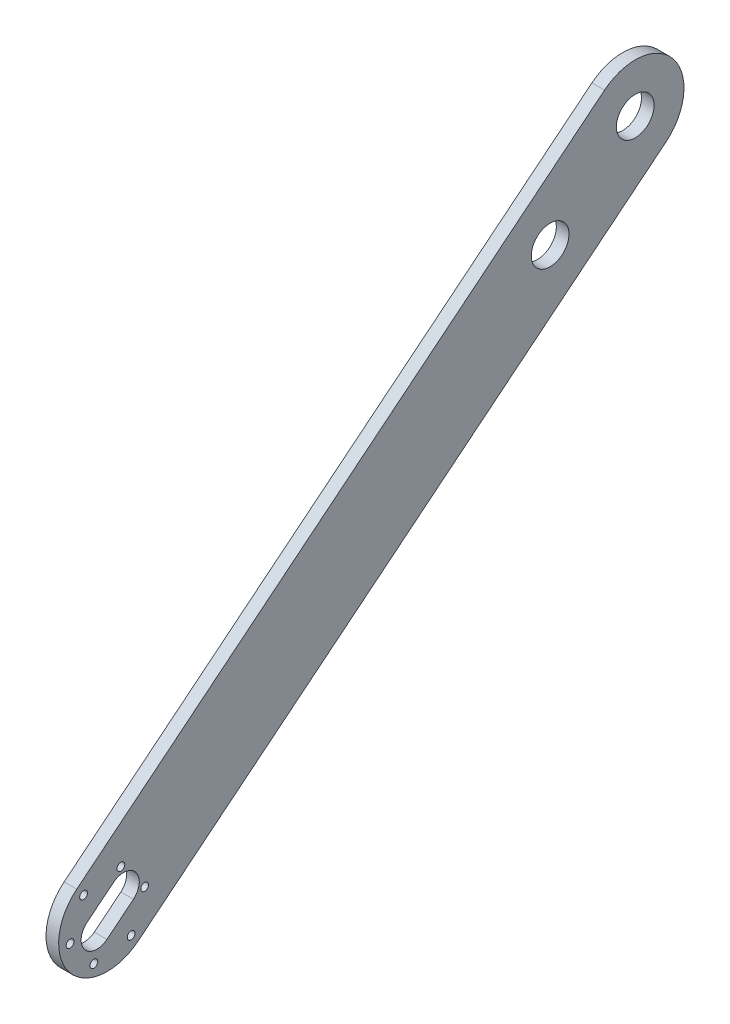
ISO-10303-21;
HEADER;
FILE_DESCRIPTION(('STEP AP214'),'2;1');
FILE_NAME('part.step','',(''),(''),'','','');
FILE_SCHEMA(('AUTOMOTIVE_DESIGN { 1 0 10303 214 1 1 1 1 }'));
ENDSEC;
DATA;
#1=APPLICATION_CONTEXT('core data for automotive mechanical design processes');
#2=APPLICATION_PROTOCOL_DEFINITION('international standard','automotive_design',2000,#1);
#3=PRODUCT_CONTEXT('',#1,'mechanical');
#4=PRODUCT('Part','Part','',(#3));
#5=PRODUCT_RELATED_PRODUCT_CATEGORY('part','',(#4));
#6=PRODUCT_DEFINITION_FORMATION('','',#4);
#7=PRODUCT_DEFINITION_CONTEXT('part definition',#1,'design');
#8=PRODUCT_DEFINITION('design','',#6,#7);
#9=PRODUCT_DEFINITION_SHAPE('','',#8);
#10=(LENGTH_UNIT() NAMED_UNIT(*) SI_UNIT(.MILLI.,.METRE.));
#11=(NAMED_UNIT(*) PLANE_ANGLE_UNIT() SI_UNIT($,.RADIAN.));
#12=(NAMED_UNIT(*) SI_UNIT($,.STERADIAN.) SOLID_ANGLE_UNIT());
#13=UNCERTAINTY_MEASURE_WITH_UNIT(LENGTH_MEASURE(1.E-05),#10,'distance_accuracy_value','');
#14=(GEOMETRIC_REPRESENTATION_CONTEXT(3) GLOBAL_UNCERTAINTY_ASSIGNED_CONTEXT((#13)) GLOBAL_UNIT_ASSIGNED_CONTEXT((#10,
#11,#12)) REPRESENTATION_CONTEXT('',''));
#15=CARTESIAN_POINT('',(0.,0.,0.));
#16=DIRECTION('',(0.,0.,1.));
#17=DIRECTION('',(1.,0.,0.));
#18=AXIS2_PLACEMENT_3D('',#15,#16,#17);
#19=CARTESIAN_POINT('',(5.1784,-110.321402288377,136.021274412376));
#20=DIRECTION('',(1.,0.,0.));
#21=DIRECTION('',(0.,0.,-1.));
#22=AXIS2_PLACEMENT_3D('',#19,#20,#21);
#23=PLANE('',#22);
#24=CARTESIAN_POINT('',(5.1784,-107.884879342951,120.713976939065));
#25=DIRECTION('',(1.,0.,0.));
#26=DIRECTION('',(0.,0.,-1.));
#27=AXIS2_PLACEMENT_3D('',#24,#25,#26);
#28=CIRCLE('',#27,1.59999999999996);
#29=CARTESIAN_POINT('',(5.1784,-107.884879342951,119.113976939065));
#30=VERTEX_POINT('',#29);
#31=EDGE_CURVE('E289',#30,#30,#28,.T.);
#32=ORIENTED_EDGE('',*,*,#31,.F.);
#33=EDGE_LOOP('',(#32));
#34=FACE_BOUND('',#33,.T.);
#35=CARTESIAN_POINT('',(5.1784,-98.2831552859189,145.785013916674));
#36=DIRECTION('',(1.,0.,0.));
#37=DIRECTION('',(0.,0.,-1.));
#38=AXIS2_PLACEMENT_3D('',#35,#36,#37);
#39=CIRCLE('',#38,1.60000000000002);
#40=CARTESIAN_POINT('',(5.1784,-98.2831552859189,144.185013916674));
#41=VERTEX_POINT('',#40);
#42=EDGE_CURVE('E301',#41,#41,#39,.T.);
#43=ORIENTED_EDGE('',*,*,#42,.F.);
#44=EDGE_LOOP('',(#43));
#45=FACE_BOUND('',#44,.T.);
#46=CARTESIAN_POINT('',(5.1784,-124.796172236263,141.564832381388));
#47=DIRECTION('',(1.,0.,0.));
#48=DIRECTION('',(0.,0.,-1.));
#49=AXIS2_PLACEMENT_3D('',#46,#47,#48);
#50=CIRCLE('',#49,1.59999999999999);
#51=CARTESIAN_POINT('',(5.1784,-124.796172236263,139.964832381388));
#52=VERTEX_POINT('',#51);
#53=EDGE_CURVE('E135',#52,#52,#50,.T.);
#54=ORIENTED_EDGE('',*,*,#53,.F.);
#55=EDGE_LOOP('',(#54));
#56=FACE_BOUND('',#55,.T.);
#57=CARTESIAN_POINT('',(5.1784,65.4259087889907,-80.6671716318812));
#58=DIRECTION('',(1.,0.,0.));
#59=DIRECTION('',(0.,0.,-1.));
#60=AXIS2_PLACEMENT_3D('',#57,#58,#59);
#61=CIRCLE('',#60,7.73749999999999);
#62=CARTESIAN_POINT('',(5.1784,65.4259087889907,-88.4046716318812));
#63=VERTEX_POINT('',#62);
#64=EDGE_CURVE('E151',#63,#63,#61,.T.);
#65=ORIENTED_EDGE('',*,*,#64,.F.);
#66=EDGE_LOOP('',(#65));
#67=FACE_BOUND('',#66,.T.);
#68=CARTESIAN_POINT('',(5.1784,-110.321402288377,136.021274412376));
#69=DIRECTION('',(1.,0.,0.));
#70=DIRECTION('',(0.,0.,-1.));
#71=AXIS2_PLACEMENT_3D('',#68,#69,#70);
#72=CIRCLE('',#71,20.);
#73=CARTESIAN_POINT('',(5.1784,-94.7881803497211,148.619647966309));
#74=VERTEX_POINT('',#73);
#75=CARTESIAN_POINT('',(5.1784,-125.854624227034,123.422900858442));
#76=VERTEX_POINT('',#75);
#77=EDGE_CURVE('E157',#74,#76,#72,.T.);
#78=ORIENTED_EDGE('',*,*,#77,.T.);
#79=DIRECTION('',(0.,0.62991867769666,-0.77666109693282));
#80=VECTOR('',#79,1.);
#81=CARTESIAN_POINT('',(5.1784,-125.854624227034,123.422900858442));
#82=LINE('',#81,#80);
#83=CARTESIAN_POINT('',(5.1784,49.8926868503343,-93.2655451858144));
#84=VERTEX_POINT('',#83);
#85=EDGE_CURVE('E160',#76,#84,#82,.T.);
#86=ORIENTED_EDGE('',*,*,#85,.T.);
#87=CARTESIAN_POINT('',(5.1784,65.4259087889907,-80.6671716318812));
#88=DIRECTION('',(1.,0.,0.));
#89=DIRECTION('',(0.,0.,-1.));
#90=AXIS2_PLACEMENT_3D('',#87,#88,#89);
#91=CIRCLE('',#90,20.);
#92=CARTESIAN_POINT('',(5.1784,80.9591307276471,-68.068798077948));
#93=VERTEX_POINT('',#92);
#94=EDGE_CURVE('E163',#84,#93,#91,.T.);
#95=ORIENTED_EDGE('',*,*,#94,.T.);
#96=DIRECTION('',(0.,-0.62991867769666,0.77666109693282));
#97=VECTOR('',#96,1.);
#98=CARTESIAN_POINT('',(5.1784,-94.7881803497211,148.619647966309));
#99=LINE('',#98,#97);
#100=EDGE_CURVE('E165',#93,#74,#99,.T.);
#101=ORIENTED_EDGE('',*,*,#100,.T.);
#102=EDGE_LOOP('',(#78,#86,#95,#101));
#103=FACE_BOUND('',#102,.T.);
#104=CARTESIAN_POINT('',(5.1784,37.079568292641,-45.7174222699043));
#105=DIRECTION('',(1.,0.,0.));
#106=DIRECTION('',(0.,0.,-1.));
#107=AXIS2_PLACEMENT_3D('',#104,#105,#106);
#108=CIRCLE('',#107,7.7375);
#109=CARTESIAN_POINT('',(5.1784,37.079568292641,-53.4549222699043));
#110=VERTEX_POINT('',#109);
#111=EDGE_CURVE('E145',#110,#110,#108,.T.);
#112=ORIENTED_EDGE('',*,*,#111,.F.);
#113=EDGE_LOOP('',(#112));
#114=FACE_BOUND('',#113,.T.);
#115=DIRECTION('',(0.,-0.629918677696662,0.776661096932819));
#116=VECTOR('',#115,1.);
#117=CARTESIAN_POINT('',(5.1784,-99.9187963978926,133.514126493475));
#118=LINE('',#117,#116);
#119=CARTESIAN_POINT('',(5.1784,-99.9187963978926,133.514126493475));
#120=VERTEX_POINT('',#119);
#121=CARTESIAN_POINT('',(5.1784,-108.737657885646,144.387381850534));
#122=VERTEX_POINT('',#121);
#123=EDGE_CURVE('E114',#120,#122,#118,.T.);
#124=ORIENTED_EDGE('',*,*,#123,.F.);
#125=CARTESIAN_POINT('',(5.1784,-104.967093527956,129.419655088447));
#126=DIRECTION('',(1.,0.,0.));
#127=DIRECTION('',(0.,0.,-1.));
#128=AXIS2_PLACEMENT_3D('',#125,#126,#127);
#129=CIRCLE('',#128,6.50000000000002);
#130=CARTESIAN_POINT('',(5.1784,-110.015390658019,125.325183683418));
#131=VERTEX_POINT('',#130);
#132=EDGE_CURVE('E106',#131,#120,#129,.T.);
#133=ORIENTED_EDGE('',*,*,#132,.F.);
#134=DIRECTION('',(0.,0.629918677696659,-0.77666109693282));
#135=VECTOR('',#134,1.);
#136=CARTESIAN_POINT('',(5.1784,-110.015390658019,125.325183683418));
#137=LINE('',#136,#135);
#138=CARTESIAN_POINT('',(5.1784,-118.834252145773,136.198439040478));
#139=VERTEX_POINT('',#138);
#140=EDGE_CURVE('E129',#139,#131,#137,.T.);
#141=ORIENTED_EDGE('',*,*,#140,.F.);
#142=CARTESIAN_POINT('',(5.1784,-113.785955015709,140.292910445506));
#143=DIRECTION('',(1.,0.,0.));
#144=DIRECTION('',(0.,0.,-1.));
#145=AXIS2_PLACEMENT_3D('',#142,#143,#144);
#146=CIRCLE('',#145,6.5);
#147=EDGE_CURVE('E127',#122,#139,#146,.T.);
#148=ORIENTED_EDGE('',*,*,#147,.F.);
#149=EDGE_LOOP('',(#124,#133,#141,#148));
#150=FACE_BOUND('',#149,.T.);
#151=CARTESIAN_POINT('',(5.1784,-112.757925233804,151.328571885686));
#152=DIRECTION('',(1.,0.,0.));
#153=DIRECTION('',(0.,0.,-1.));
#154=AXIS2_PLACEMENT_3D('',#151,#152,#153);
#155=CIRCLE('',#154,1.59999999999999);
#156=CARTESIAN_POINT('',(5.1784,-112.757925233804,149.728571885686));
#157=VERTEX_POINT('',#156);
#158=EDGE_CURVE('E307',#157,#157,#155,.T.);
#159=ORIENTED_EDGE('',*,*,#158,.F.);
#160=EDGE_LOOP('',(#159));
#161=FACE_BOUND('',#160,.T.);
#162=CARTESIAN_POINT('',(5.1784,-95.8466323404922,130.477716443364));
#163=DIRECTION('',(1.,0.,0.));
#164=DIRECTION('',(0.,0.,-1.));
#165=AXIS2_PLACEMENT_3D('',#162,#163,#164);
#166=CIRCLE('',#165,1.60000000000002);
#167=CARTESIAN_POINT('',(5.1784,-95.8466323404922,128.877716443364));
#168=VERTEX_POINT('',#167);
#169=EDGE_CURVE('E295',#168,#168,#166,.T.);
#170=ORIENTED_EDGE('',*,*,#169,.F.);
#171=EDGE_LOOP('',(#170));
#172=FACE_BOUND('',#171,.T.);
#173=CARTESIAN_POINT('',(5.1784,-122.359649290836,126.257534908077));
#174=DIRECTION('',(1.,0.,0.));
#175=DIRECTION('',(0.,0.,-1.));
#176=AXIS2_PLACEMENT_3D('',#173,#174,#175);
#177=CIRCLE('',#176,1.59999999999999);
#178=CARTESIAN_POINT('',(5.1784,-122.359649290836,124.657534908077));
#179=VERTEX_POINT('',#178);
#180=EDGE_CURVE('E280',#179,#179,#177,.T.);
#181=ORIENTED_EDGE('',*,*,#180,.F.);
#182=EDGE_LOOP('',(#181));
#183=FACE_BOUND('',#182,.T.);
#184=ADVANCED_FACE('F41',(#34,#45,#56,#67,#103,#114,#150,#161,#172,#183),#23,.T.);
#185=CARTESIAN_POINT('',(0.,-110.321402288377,136.021274412376));
#186=DIRECTION('',(1.,0.,0.));
#187=DIRECTION('',(0.,0.,-1.));
#188=AXIS2_PLACEMENT_3D('',#185,#186,#187);
#189=PLANE('',#188);
#190=CARTESIAN_POINT('',(0.,37.079568292641,-45.7174222699043));
#191=DIRECTION('',(1.,0.,0.));
#192=DIRECTION('',(0.,0.,-1.));
#193=AXIS2_PLACEMENT_3D('',#190,#191,#192);
#194=CIRCLE('',#193,7.7375);
#195=CARTESIAN_POINT('',(0.,37.079568292641,-53.4549222699043));
#196=VERTEX_POINT('',#195);
#197=EDGE_CURVE('E122',#196,#196,#194,.T.);
#198=ORIENTED_EDGE('',*,*,#197,.T.);
#199=EDGE_LOOP('',(#198));
#200=FACE_BOUND('',#199,.T.);
#201=CARTESIAN_POINT('',(0.,65.4259087889907,-80.6671716318812));
#202=DIRECTION('',(1.,0.,0.));
#203=DIRECTION('',(0.,0.,-1.));
#204=AXIS2_PLACEMENT_3D('',#201,#202,#203);
#205=CIRCLE('',#204,7.73749999999999);
#206=CARTESIAN_POINT('',(0.,65.4259087889907,-88.4046716318812));
#207=VERTEX_POINT('',#206);
#208=EDGE_CURVE('E148',#207,#207,#205,.T.);
#209=ORIENTED_EDGE('',*,*,#208,.T.);
#210=EDGE_LOOP('',(#209));
#211=FACE_BOUND('',#210,.T.);
#212=CARTESIAN_POINT('',(0.,-110.321402288377,136.021274412376));
#213=DIRECTION('',(1.,0.,0.));
#214=DIRECTION('',(0.,0.,-1.));
#215=AXIS2_PLACEMENT_3D('',#212,#213,#214);
#216=CIRCLE('',#215,20.);
#217=CARTESIAN_POINT('',(0.,-94.7881803497211,148.619647966309));
#218=VERTEX_POINT('',#217);
#219=CARTESIAN_POINT('',(0.,-125.854624227034,123.422900858442));
#220=VERTEX_POINT('',#219);
#221=EDGE_CURVE('E154',#218,#220,#216,.T.);
#222=ORIENTED_EDGE('',*,*,#221,.F.);
#223=DIRECTION('',(0.,-0.62991867769666,0.77666109693282));
#224=VECTOR('',#223,1.);
#225=CARTESIAN_POINT('',(0.,-94.7881803497211,148.619647966309));
#226=LINE('',#225,#224);
#227=CARTESIAN_POINT('',(0.,80.9591307276471,-68.068798077948));
#228=VERTEX_POINT('',#227);
#229=EDGE_CURVE('E161',#228,#218,#226,.T.);
#230=ORIENTED_EDGE('',*,*,#229,.F.);
#231=CARTESIAN_POINT('',(0.,65.4259087889907,-80.6671716318812));
#232=DIRECTION('',(1.,0.,0.));
#233=DIRECTION('',(0.,0.,-1.));
#234=AXIS2_PLACEMENT_3D('',#231,#232,#233);
#235=CIRCLE('',#234,20.);
#236=CARTESIAN_POINT('',(0.,49.8926868503343,-93.2655451858144));
#237=VERTEX_POINT('',#236);
#238=EDGE_CURVE('E172',#237,#228,#235,.T.);
#239=ORIENTED_EDGE('',*,*,#238,.F.);
#240=DIRECTION('',(0.,0.62991867769666,-0.77666109693282));
#241=VECTOR('',#240,1.);
#242=CARTESIAN_POINT('',(0.,-125.854624227034,123.422900858442));
#243=LINE('',#242,#241);
#244=EDGE_CURVE('E170',#220,#237,#243,.T.);
#245=ORIENTED_EDGE('',*,*,#244,.F.);
#246=EDGE_LOOP('',(#222,#230,#239,#245));
#247=FACE_BOUND('',#246,.T.);
#248=CARTESIAN_POINT('',(0.,-104.967093527956,129.419655088447));
#249=DIRECTION('',(1.,0.,0.));
#250=DIRECTION('',(0.,0.,-1.));
#251=AXIS2_PLACEMENT_3D('',#248,#249,#250);
#252=CIRCLE('',#251,6.50000000000002);
#253=CARTESIAN_POINT('',(0.,-110.015390658019,125.325183683418));
#254=VERTEX_POINT('',#253);
#255=CARTESIAN_POINT('',(0.,-99.9187963978926,133.514126493475));
#256=VERTEX_POINT('',#255);
#257=EDGE_CURVE('E64',#254,#256,#252,.T.);
#258=ORIENTED_EDGE('',*,*,#257,.T.);
#259=DIRECTION('',(0.,-0.629918677696662,0.776661096932819));
#260=VECTOR('',#259,1.);
#261=CARTESIAN_POINT('',(0.,-99.9187963978926,133.514126493475));
#262=LINE('',#261,#260);
#263=CARTESIAN_POINT('',(0.,-108.737657885646,144.387381850534));
#264=VERTEX_POINT('',#263);
#265=EDGE_CURVE('E121',#256,#264,#262,.T.);
#266=ORIENTED_EDGE('',*,*,#265,.T.);
#267=CARTESIAN_POINT('',(0.,-113.785955015709,140.292910445506));
#268=DIRECTION('',(1.,0.,0.));
#269=DIRECTION('',(0.,0.,-1.));
#270=AXIS2_PLACEMENT_3D('',#267,#268,#269);
#271=CIRCLE('',#270,6.5);
#272=CARTESIAN_POINT('',(0.,-118.834252145773,136.198439040478));
#273=VERTEX_POINT('',#272);
#274=EDGE_CURVE('E137',#264,#273,#271,.T.);
#275=ORIENTED_EDGE('',*,*,#274,.T.);
#276=DIRECTION('',(0.,0.629918677696659,-0.77666109693282));
#277=VECTOR('',#276,1.);
#278=CARTESIAN_POINT('',(0.,-110.015390658019,125.325183683418));
#279=LINE('',#278,#277);
#280=EDGE_CURVE('E115',#273,#254,#279,.T.);
#281=ORIENTED_EDGE('',*,*,#280,.T.);
#282=EDGE_LOOP('',(#258,#266,#275,#281));
#283=FACE_BOUND('',#282,.T.);
#284=CARTESIAN_POINT('',(0.,-124.796172236263,141.564832381388));
#285=DIRECTION('',(1.,0.,0.));
#286=DIRECTION('',(0.,0.,-1.));
#287=AXIS2_PLACEMENT_3D('',#284,#285,#286);
#288=CIRCLE('',#287,1.59999999999999);
#289=CARTESIAN_POINT('',(0.,-124.796172236263,139.964832381388));
#290=VERTEX_POINT('',#289);
#291=EDGE_CURVE('E310',#290,#290,#288,.T.);
#292=ORIENTED_EDGE('',*,*,#291,.T.);
#293=EDGE_LOOP('',(#292));
#294=FACE_BOUND('',#293,.T.);
#295=CARTESIAN_POINT('',(0.,-112.757925233804,151.328571885686));
#296=DIRECTION('',(1.,0.,0.));
#297=DIRECTION('',(0.,0.,-1.));
#298=AXIS2_PLACEMENT_3D('',#295,#296,#297);
#299=CIRCLE('',#298,1.59999999999999);
#300=CARTESIAN_POINT('',(0.,-112.757925233804,149.728571885686));
#301=VERTEX_POINT('',#300);
#302=EDGE_CURVE('E304',#301,#301,#299,.T.);
#303=ORIENTED_EDGE('',*,*,#302,.T.);
#304=EDGE_LOOP('',(#303));
#305=FACE_BOUND('',#304,.T.);
#306=CARTESIAN_POINT('',(0.,-98.2831552859189,145.785013916674));
#307=DIRECTION('',(1.,0.,0.));
#308=DIRECTION('',(0.,0.,-1.));
#309=AXIS2_PLACEMENT_3D('',#306,#307,#308);
#310=CIRCLE('',#309,1.60000000000002);
#311=CARTESIAN_POINT('',(0.,-98.2831552859189,144.185013916674));
#312=VERTEX_POINT('',#311);
#313=EDGE_CURVE('E298',#312,#312,#310,.T.);
#314=ORIENTED_EDGE('',*,*,#313,.T.);
#315=EDGE_LOOP('',(#314));
#316=FACE_BOUND('',#315,.T.);
#317=CARTESIAN_POINT('',(0.,-95.8466323404922,130.477716443364));
#318=DIRECTION('',(1.,0.,0.));
#319=DIRECTION('',(0.,0.,-1.));
#320=AXIS2_PLACEMENT_3D('',#317,#318,#319);
#321=CIRCLE('',#320,1.60000000000002);
#322=CARTESIAN_POINT('',(0.,-95.8466323404922,128.877716443364));
#323=VERTEX_POINT('',#322);
#324=EDGE_CURVE('E292',#323,#323,#321,.T.);
#325=ORIENTED_EDGE('',*,*,#324,.T.);
#326=EDGE_LOOP('',(#325));
#327=FACE_BOUND('',#326,.T.);
#328=CARTESIAN_POINT('',(0.,-107.884879342951,120.713976939065));
#329=DIRECTION('',(1.,0.,0.));
#330=DIRECTION('',(0.,0.,-1.));
#331=AXIS2_PLACEMENT_3D('',#328,#329,#330);
#332=CIRCLE('',#331,1.59999999999996);
#333=CARTESIAN_POINT('',(0.,-107.884879342951,119.113976939065));
#334=VERTEX_POINT('',#333);
#335=EDGE_CURVE('E286',#334,#334,#332,.T.);
#336=ORIENTED_EDGE('',*,*,#335,.T.);
#337=EDGE_LOOP('',(#336));
#338=FACE_BOUND('',#337,.T.);
#339=CARTESIAN_POINT('',(0.,-122.359649290836,126.257534908077));
#340=DIRECTION('',(1.,0.,0.));
#341=DIRECTION('',(0.,0.,-1.));
#342=AXIS2_PLACEMENT_3D('',#339,#340,#341);
#343=CIRCLE('',#342,1.59999999999999);
#344=CARTESIAN_POINT('',(0.,-122.359649290836,124.657534908077));
#345=VERTEX_POINT('',#344);
#346=EDGE_CURVE('E283',#345,#345,#343,.T.);
#347=ORIENTED_EDGE('',*,*,#346,.T.);
#348=EDGE_LOOP('',(#347));
#349=FACE_BOUND('',#348,.T.);
#350=ADVANCED_FACE('F190',(#200,#211,#247,#283,#294,#305,#316,#327,#338,#349),#189,.F.);
#351=CARTESIAN_POINT('',(5.1784,-110.321402288377,136.021274412376));
#352=DIRECTION('',(-1.,0.,0.));
#353=DIRECTION('',(0.,0.,1.));
#354=AXIS2_PLACEMENT_3D('',#351,#352,#353);
#355=CYLINDRICAL_SURFACE('',#354,20.);
#356=ORIENTED_EDGE('',*,*,#221,.T.);
#357=DIRECTION('',(-1.,0.,0.));
#358=VECTOR('',#357,1.);
#359=CARTESIAN_POINT('',(5.1784,-125.854624227034,123.422900858442));
#360=LINE('',#359,#358);
#361=EDGE_CURVE('E11',#76,#220,#360,.T.);
#362=ORIENTED_EDGE('',*,*,#361,.F.);
#363=ORIENTED_EDGE('',*,*,#77,.F.);
#364=DIRECTION('',(-1.,0.,0.));
#365=VECTOR('',#364,1.);
#366=CARTESIAN_POINT('',(5.1784,-94.7881803497211,148.619647966309));
#367=LINE('',#366,#365);
#368=EDGE_CURVE('E167',#74,#218,#367,.T.);
#369=ORIENTED_EDGE('',*,*,#368,.T.);
#370=EDGE_LOOP('',(#356,#362,#363,#369));
#371=FACE_BOUND('',#370,.T.);
#372=ADVANCED_FACE('F43',(#371),#355,.T.);
#373=CARTESIAN_POINT('',(5.1784,-125.854624227034,123.422900858442));
#374=DIRECTION('',(0.,0.77666109693282,0.62991867769666));
#375=DIRECTION('',(0.,-0.62991867769666,0.77666109693282));
#376=AXIS2_PLACEMENT_3D('',#373,#374,#375);
#377=PLANE('',#376);
#378=ORIENTED_EDGE('',*,*,#244,.T.);
#379=DIRECTION('',(-1.,0.,0.));
#380=VECTOR('',#379,1.);
#381=CARTESIAN_POINT('',(5.1784,49.8926868503343,-93.2655451858144));
#382=LINE('',#381,#380);
#383=EDGE_CURVE('E49',#84,#237,#382,.T.);
#384=ORIENTED_EDGE('',*,*,#383,.F.);
#385=ORIENTED_EDGE('',*,*,#85,.F.);
#386=ORIENTED_EDGE('',*,*,#361,.T.);
#387=EDGE_LOOP('',(#378,#384,#385,#386));
#388=FACE_BOUND('',#387,.T.);
#389=ADVANCED_FACE('F201',(#388),#377,.F.);
#390=CARTESIAN_POINT('',(5.1784,65.4259087889907,-80.6671716318812));
#391=DIRECTION('',(-1.,0.,0.));
#392=DIRECTION('',(0.,0.,1.));
#393=AXIS2_PLACEMENT_3D('',#390,#391,#392);
#394=CYLINDRICAL_SURFACE('',#393,20.);
#395=ORIENTED_EDGE('',*,*,#238,.T.);
#396=DIRECTION('',(-1.,0.,0.));
#397=VECTOR('',#396,1.);
#398=CARTESIAN_POINT('',(5.1784,80.9591307276471,-68.068798077948));
#399=LINE('',#398,#397);
#400=EDGE_CURVE('E177',#93,#228,#399,.T.);
#401=ORIENTED_EDGE('',*,*,#400,.F.);
#402=ORIENTED_EDGE('',*,*,#94,.F.);
#403=ORIENTED_EDGE('',*,*,#383,.T.);
#404=EDGE_LOOP('',(#395,#401,#402,#403));
#405=FACE_BOUND('',#404,.T.);
#406=ADVANCED_FACE('F184',(#405),#394,.T.);
#407=CARTESIAN_POINT('',(5.1784,-94.7881803497211,148.619647966309));
#408=DIRECTION('',(0.,-0.77666109693282,-0.62991867769666));
#409=DIRECTION('',(0.,0.62991867769666,-0.77666109693282));
#410=AXIS2_PLACEMENT_3D('',#407,#408,#409);
#411=PLANE('',#410);
#412=ORIENTED_EDGE('',*,*,#229,.T.);
#413=ORIENTED_EDGE('',*,*,#368,.F.);
#414=ORIENTED_EDGE('',*,*,#100,.F.);
#415=ORIENTED_EDGE('',*,*,#400,.T.);
#416=EDGE_LOOP('',(#412,#413,#414,#415));
#417=FACE_BOUND('',#416,.T.);
#418=ADVANCED_FACE('F194',(#417),#411,.F.);
#419=CARTESIAN_POINT('',(5.1784,65.4259087889907,-80.6671716318812));
#420=DIRECTION('',(-1.,0.,0.));
#421=DIRECTION('',(0.,0.,1.));
#422=AXIS2_PLACEMENT_3D('',#419,#420,#421);
#423=CYLINDRICAL_SURFACE('',#422,7.73749999999999);
#424=ORIENTED_EDGE('',*,*,#64,.T.);
#425=EDGE_LOOP('',(#424));
#426=FACE_BOUND('',#425,.T.);
#427=ORIENTED_EDGE('',*,*,#208,.F.);
#428=EDGE_LOOP('',(#427));
#429=FACE_BOUND('',#428,.T.);
#430=ADVANCED_FACE('F219',(#426,#429),#423,.F.);
#431=CARTESIAN_POINT('',(5.1784,37.079568292641,-45.7174222699043));
#432=DIRECTION('',(-1.,0.,0.));
#433=DIRECTION('',(0.,0.,1.));
#434=AXIS2_PLACEMENT_3D('',#431,#432,#433);
#435=CYLINDRICAL_SURFACE('',#434,7.7375);
#436=ORIENTED_EDGE('',*,*,#111,.T.);
#437=EDGE_LOOP('',(#436));
#438=FACE_BOUND('',#437,.T.);
#439=ORIENTED_EDGE('',*,*,#197,.F.);
#440=EDGE_LOOP('',(#439));
#441=FACE_BOUND('',#440,.T.);
#442=ADVANCED_FACE('F226',(#438,#441),#435,.F.);
#443=CARTESIAN_POINT('',(5.1784,-104.967093527956,129.419655088447));
#444=DIRECTION('',(-1.,0.,0.));
#445=DIRECTION('',(0.,0.,1.));
#446=AXIS2_PLACEMENT_3D('',#443,#444,#445);
#447=CYLINDRICAL_SURFACE('',#446,6.50000000000002);
#448=ORIENTED_EDGE('',*,*,#257,.F.);
#449=DIRECTION('',(-1.,0.,0.));
#450=VECTOR('',#449,1.);
#451=CARTESIAN_POINT('',(5.1784,-110.015390658019,125.325183683418));
#452=LINE('',#451,#450);
#453=EDGE_CURVE('E110',#131,#254,#452,.T.);
#454=ORIENTED_EDGE('',*,*,#453,.F.);
#455=ORIENTED_EDGE('',*,*,#132,.T.);
#456=DIRECTION('',(-1.,0.,0.));
#457=VECTOR('',#456,1.);
#458=CARTESIAN_POINT('',(5.1784,-99.9187963978926,133.514126493475));
#459=LINE('',#458,#457);
#460=EDGE_CURVE('E109',#120,#256,#459,.T.);
#461=ORIENTED_EDGE('',*,*,#460,.T.);
#462=EDGE_LOOP('',(#448,#454,#455,#461));
#463=FACE_BOUND('',#462,.T.);
#464=ADVANCED_FACE('F108',(#463),#447,.F.);
#465=CARTESIAN_POINT('',(5.1784,-99.9187963978926,133.514126493475));
#466=DIRECTION('',(0.,-0.776661096932819,-0.629918677696662));
#467=DIRECTION('',(0.,0.629918677696662,-0.776661096932819));
#468=AXIS2_PLACEMENT_3D('',#465,#466,#467);
#469=PLANE('',#468);
#470=ORIENTED_EDGE('',*,*,#265,.F.);
#471=ORIENTED_EDGE('',*,*,#460,.F.);
#472=ORIENTED_EDGE('',*,*,#123,.T.);
#473=DIRECTION('',(-1.,0.,0.));
#474=VECTOR('',#473,1.);
#475=CARTESIAN_POINT('',(5.1784,-108.737657885646,144.387381850534));
#476=LINE('',#475,#474);
#477=EDGE_CURVE('E123',#122,#264,#476,.T.);
#478=ORIENTED_EDGE('',*,*,#477,.T.);
#479=EDGE_LOOP('',(#470,#471,#472,#478));
#480=FACE_BOUND('',#479,.T.);
#481=ADVANCED_FACE('F118',(#480),#469,.T.);
#482=CARTESIAN_POINT('',(5.1784,-113.785955015709,140.292910445506));
#483=DIRECTION('',(-1.,0.,0.));
#484=DIRECTION('',(0.,0.,1.));
#485=AXIS2_PLACEMENT_3D('',#482,#483,#484);
#486=CYLINDRICAL_SURFACE('',#485,6.5);
#487=ORIENTED_EDGE('',*,*,#274,.F.);
#488=ORIENTED_EDGE('',*,*,#477,.F.);
#489=ORIENTED_EDGE('',*,*,#147,.T.);
#490=DIRECTION('',(-1.,0.,0.));
#491=VECTOR('',#490,1.);
#492=CARTESIAN_POINT('',(5.1784,-118.834252145773,136.198439040478));
#493=LINE('',#492,#491);
#494=EDGE_CURVE('E56',#139,#273,#493,.T.);
#495=ORIENTED_EDGE('',*,*,#494,.T.);
#496=EDGE_LOOP('',(#487,#488,#489,#495));
#497=FACE_BOUND('',#496,.T.);
#498=ADVANCED_FACE('F245',(#497),#486,.F.);
#499=CARTESIAN_POINT('',(5.1784,-110.015390658019,125.325183683418));
#500=DIRECTION('',(0.,0.77666109693282,0.62991867769666));
#501=DIRECTION('',(0.,-0.62991867769666,0.77666109693282));
#502=AXIS2_PLACEMENT_3D('',#499,#500,#501);
#503=PLANE('',#502);
#504=ORIENTED_EDGE('',*,*,#280,.F.);
#505=ORIENTED_EDGE('',*,*,#494,.F.);
#506=ORIENTED_EDGE('',*,*,#140,.T.);
#507=ORIENTED_EDGE('',*,*,#453,.T.);
#508=EDGE_LOOP('',(#504,#505,#506,#507));
#509=FACE_BOUND('',#508,.T.);
#510=ADVANCED_FACE('F248',(#509),#503,.T.);
#511=CARTESIAN_POINT('',(5.1784,-124.796172236263,141.564832381388));
#512=DIRECTION('',(-1.,0.,0.));
#513=DIRECTION('',(0.,0.,1.));
#514=AXIS2_PLACEMENT_3D('',#511,#512,#513);
#515=CYLINDRICAL_SURFACE('',#514,1.59999999999999);
#516=ORIENTED_EDGE('',*,*,#53,.T.);
#517=EDGE_LOOP('',(#516));
#518=FACE_BOUND('',#517,.T.);
#519=ORIENTED_EDGE('',*,*,#291,.F.);
#520=EDGE_LOOP('',(#519));
#521=FACE_BOUND('',#520,.T.);
#522=ADVANCED_FACE('F252',(#518,#521),#515,.F.);
#523=CARTESIAN_POINT('',(5.1784,-112.757925233804,151.328571885686));
#524=DIRECTION('',(-1.,0.,0.));
#525=DIRECTION('',(0.,0.,1.));
#526=AXIS2_PLACEMENT_3D('',#523,#524,#525);
#527=CYLINDRICAL_SURFACE('',#526,1.59999999999999);
#528=ORIENTED_EDGE('',*,*,#158,.T.);
#529=EDGE_LOOP('',(#528));
#530=FACE_BOUND('',#529,.T.);
#531=ORIENTED_EDGE('',*,*,#302,.F.);
#532=EDGE_LOOP('',(#531));
#533=FACE_BOUND('',#532,.T.);
#534=ADVANCED_FACE('F255',(#530,#533),#527,.F.);
#535=CARTESIAN_POINT('',(5.1784,-98.2831552859189,145.785013916674));
#536=DIRECTION('',(-1.,0.,0.));
#537=DIRECTION('',(0.,0.,1.));
#538=AXIS2_PLACEMENT_3D('',#535,#536,#537);
#539=CYLINDRICAL_SURFACE('',#538,1.60000000000002);
#540=ORIENTED_EDGE('',*,*,#42,.T.);
#541=EDGE_LOOP('',(#540));
#542=FACE_BOUND('',#541,.T.);
#543=ORIENTED_EDGE('',*,*,#313,.F.);
#544=EDGE_LOOP('',(#543));
#545=FACE_BOUND('',#544,.T.);
#546=ADVANCED_FACE('F259',(#542,#545),#539,.F.);
#547=CARTESIAN_POINT('',(5.1784,-95.8466323404922,130.477716443364));
#548=DIRECTION('',(-1.,0.,0.));
#549=DIRECTION('',(0.,0.,1.));
#550=AXIS2_PLACEMENT_3D('',#547,#548,#549);
#551=CYLINDRICAL_SURFACE('',#550,1.60000000000002);
#552=ORIENTED_EDGE('',*,*,#169,.T.);
#553=EDGE_LOOP('',(#552));
#554=FACE_BOUND('',#553,.T.);
#555=ORIENTED_EDGE('',*,*,#324,.F.);
#556=EDGE_LOOP('',(#555));
#557=FACE_BOUND('',#556,.T.);
#558=ADVANCED_FACE('F263',(#554,#557),#551,.F.);
#559=CARTESIAN_POINT('',(5.1784,-107.884879342951,120.713976939065));
#560=DIRECTION('',(-1.,0.,0.));
#561=DIRECTION('',(0.,0.,1.));
#562=AXIS2_PLACEMENT_3D('',#559,#560,#561);
#563=CYLINDRICAL_SURFACE('',#562,1.59999999999996);
#564=ORIENTED_EDGE('',*,*,#31,.T.);
#565=EDGE_LOOP('',(#564));
#566=FACE_BOUND('',#565,.T.);
#567=ORIENTED_EDGE('',*,*,#335,.F.);
#568=EDGE_LOOP('',(#567));
#569=FACE_BOUND('',#568,.T.);
#570=ADVANCED_FACE('F267',(#566,#569),#563,.F.);
#571=CARTESIAN_POINT('',(5.1784,-122.359649290836,126.257534908077));
#572=DIRECTION('',(-1.,0.,0.));
#573=DIRECTION('',(0.,0.,1.));
#574=AXIS2_PLACEMENT_3D('',#571,#572,#573);
#575=CYLINDRICAL_SURFACE('',#574,1.59999999999999);
#576=ORIENTED_EDGE('',*,*,#180,.T.);
#577=EDGE_LOOP('',(#576));
#578=FACE_BOUND('',#577,.T.);
#579=ORIENTED_EDGE('',*,*,#346,.F.);
#580=EDGE_LOOP('',(#579));
#581=FACE_BOUND('',#580,.T.);
#582=ADVANCED_FACE('F271',(#578,#581),#575,.F.);
#583=CLOSED_SHELL('',(#184,#350,#372,#389,#406,#418,#430,#442,#464,#481,#498,#510,#522,#534,
#546,#558,#570,#582));
#584=MANIFOLD_SOLID_BREP('B2',#583);
#585=ADVANCED_BREP_SHAPE_REPRESENTATION('',(#18,#584),#14);
#586=SHAPE_DEFINITION_REPRESENTATION(#9,#585);
ENDSEC;
END-ISO-10303-21;
